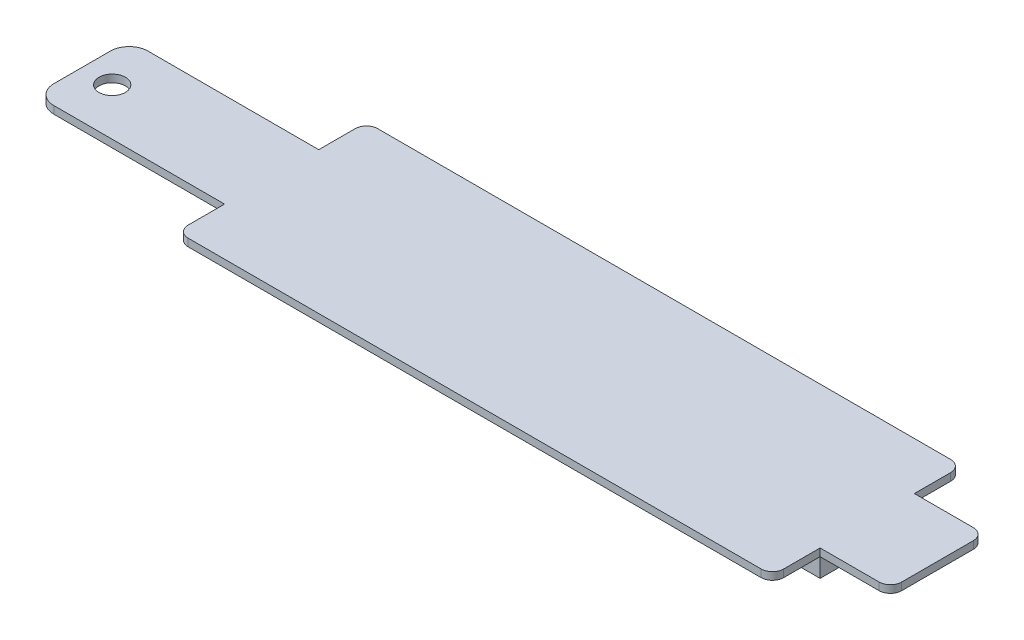
ISO-10303-21;
HEADER;
FILE_DESCRIPTION(('STEP AP214'),'2;1');
FILE_NAME('part.step','',(''),(''),'','','');
FILE_SCHEMA(('AUTOMOTIVE_DESIGN { 1 0 10303 214 1 1 1 1 }'));
ENDSEC;
DATA;
#1=APPLICATION_CONTEXT('core data for automotive mechanical design processes');
#2=APPLICATION_PROTOCOL_DEFINITION('international standard','automotive_design',2000,#1);
#3=PRODUCT_CONTEXT('',#1,'mechanical');
#4=PRODUCT('Part','Part','',(#3));
#5=PRODUCT_RELATED_PRODUCT_CATEGORY('part','',(#4));
#6=PRODUCT_DEFINITION_FORMATION('','',#4);
#7=PRODUCT_DEFINITION_CONTEXT('part definition',#1,'design');
#8=PRODUCT_DEFINITION('design','',#6,#7);
#9=PRODUCT_DEFINITION_SHAPE('','',#8);
#10=(LENGTH_UNIT() NAMED_UNIT(*) SI_UNIT(.MILLI.,.METRE.));
#11=(NAMED_UNIT(*) PLANE_ANGLE_UNIT() SI_UNIT($,.RADIAN.));
#12=(NAMED_UNIT(*) SI_UNIT($,.STERADIAN.) SOLID_ANGLE_UNIT());
#13=UNCERTAINTY_MEASURE_WITH_UNIT(LENGTH_MEASURE(1.E-05),#10,'distance_accuracy_value','');
#14=(GEOMETRIC_REPRESENTATION_CONTEXT(3) GLOBAL_UNCERTAINTY_ASSIGNED_CONTEXT((#13)) GLOBAL_UNIT_ASSIGNED_CONTEXT((#10,
#11,#12)) REPRESENTATION_CONTEXT('',''));
#15=CARTESIAN_POINT('',(0.,0.,0.));
#16=DIRECTION('',(0.,0.,1.));
#17=DIRECTION('',(1.,0.,0.));
#18=AXIS2_PLACEMENT_3D('',#15,#16,#17);
#19=CARTESIAN_POINT('',(79.,-7.,-12.5));
#20=DIRECTION('',(-1.,0.,0.));
#21=DIRECTION('',(0.,0.,1.));
#22=AXIS2_PLACEMENT_3D('',#19,#20,#21);
#23=PLANE('',#22);
#24=DIRECTION('',(0.,0.,1.));
#25=VECTOR('',#24,1.);
#26=CARTESIAN_POINT('',(79.,-2.,-12.5));
#27=LINE('',#26,#25);
#28=CARTESIAN_POINT('',(79.,-2.,-12.5));
#29=VERTEX_POINT('',#28);
#30=CARTESIAN_POINT('',(79.,-2.,12.5));
#31=VERTEX_POINT('',#30);
#32=EDGE_CURVE('E231',#29,#31,#27,.T.);
#33=ORIENTED_EDGE('',*,*,#32,.T.);
#34=DIRECTION('',(0.,1.,0.));
#35=VECTOR('',#34,1.);
#36=CARTESIAN_POINT('',(79.,-7.,12.5));
#37=LINE('',#36,#35);
#38=CARTESIAN_POINT('',(79.,-7.,12.5));
#39=VERTEX_POINT('',#38);
#40=EDGE_CURVE('E14',#39,#31,#37,.T.);
#41=ORIENTED_EDGE('',*,*,#40,.F.);
#42=DIRECTION('',(0.,0.,1.));
#43=VECTOR('',#42,1.);
#44=CARTESIAN_POINT('',(79.,-7.,-12.5));
#45=LINE('',#44,#43);
#46=CARTESIAN_POINT('',(79.,-7.,-12.5));
#47=VERTEX_POINT('',#46);
#48=EDGE_CURVE('E215',#47,#39,#45,.T.);
#49=ORIENTED_EDGE('',*,*,#48,.F.);
#50=DIRECTION('',(0.,1.,0.));
#51=VECTOR('',#50,1.);
#52=CARTESIAN_POINT('',(79.,-7.,-12.5));
#53=LINE('',#52,#51);
#54=EDGE_CURVE('E227',#47,#29,#53,.T.);
#55=ORIENTED_EDGE('',*,*,#54,.T.);
#56=EDGE_LOOP('',(#33,#41,#49,#55));
#57=FACE_BOUND('',#56,.T.);
#58=ADVANCED_FACE('F163',(#57),#23,.F.);
#59=CARTESIAN_POINT('',(-79.,-7.,12.5));
#60=DIRECTION('',(0.,0.,-1.));
#61=DIRECTION('',(-1.,0.,0.));
#62=AXIS2_PLACEMENT_3D('',#59,#60,#61);
#63=PLANE('',#62);
#64=DIRECTION('',(-1.,0.,0.));
#65=VECTOR('',#64,1.);
#66=CARTESIAN_POINT('',(-79.,-2.,12.5));
#67=LINE('',#66,#65);
#68=CARTESIAN_POINT('',(-79.,-2.,12.5));
#69=VERTEX_POINT('',#68);
#70=EDGE_CURVE('E220',#31,#69,#67,.T.);
#71=ORIENTED_EDGE('',*,*,#70,.T.);
#72=DIRECTION('',(0.,1.,0.));
#73=VECTOR('',#72,1.);
#74=CARTESIAN_POINT('',(-79.,-7.,12.5));
#75=LINE('',#74,#73);
#76=CARTESIAN_POINT('',(-79.,-7.,12.5));
#77=VERTEX_POINT('',#76);
#78=EDGE_CURVE('E172',#77,#69,#75,.T.);
#79=ORIENTED_EDGE('',*,*,#78,.F.);
#80=DIRECTION('',(-1.,0.,0.));
#81=VECTOR('',#80,1.);
#82=CARTESIAN_POINT('',(-79.,-7.,12.5));
#83=LINE('',#82,#81);
#84=EDGE_CURVE('E210',#39,#77,#83,.T.);
#85=ORIENTED_EDGE('',*,*,#84,.F.);
#86=ORIENTED_EDGE('',*,*,#40,.T.);
#87=EDGE_LOOP('',(#71,#79,#85,#86));
#88=FACE_BOUND('',#87,.T.);
#89=ADVANCED_FACE('F219',(#88),#63,.F.);
#90=CARTESIAN_POINT('',(-79.,-7.,12.5));
#91=DIRECTION('',(1.,0.,0.));
#92=DIRECTION('',(0.,0.,-1.));
#93=AXIS2_PLACEMENT_3D('',#90,#91,#92);
#94=PLANE('',#93);
#95=DIRECTION('',(0.,0.,-1.));
#96=VECTOR('',#95,1.);
#97=CARTESIAN_POINT('',(-79.,-2.,12.5));
#98=LINE('',#97,#96);
#99=CARTESIAN_POINT('',(-79.,-2.,-12.5));
#100=VERTEX_POINT('',#99);
#101=EDGE_CURVE('E197',#69,#100,#98,.T.);
#102=ORIENTED_EDGE('',*,*,#101,.T.);
#103=DIRECTION('',(0.,1.,0.));
#104=VECTOR('',#103,1.);
#105=CARTESIAN_POINT('',(-79.,-7.,-12.5));
#106=LINE('',#105,#104);
#107=CARTESIAN_POINT('',(-79.,-7.,-12.5));
#108=VERTEX_POINT('',#107);
#109=EDGE_CURVE('E222',#108,#100,#106,.T.);
#110=ORIENTED_EDGE('',*,*,#109,.F.);
#111=DIRECTION('',(0.,0.,-1.));
#112=VECTOR('',#111,1.);
#113=CARTESIAN_POINT('',(-79.,-7.,12.5));
#114=LINE('',#113,#112);
#115=EDGE_CURVE('E213',#77,#108,#114,.T.);
#116=ORIENTED_EDGE('',*,*,#115,.F.);
#117=ORIENTED_EDGE('',*,*,#78,.T.);
#118=EDGE_LOOP('',(#102,#110,#116,#117));
#119=FACE_BOUND('',#118,.T.);
#120=ADVANCED_FACE('F223',(#119),#94,.F.);
#121=CARTESIAN_POINT('',(-79.,-7.,-12.5));
#122=DIRECTION('',(0.,0.,1.));
#123=DIRECTION('',(1.,0.,0.));
#124=AXIS2_PLACEMENT_3D('',#121,#122,#123);
#125=PLANE('',#124);
#126=DIRECTION('',(1.,0.,0.));
#127=VECTOR('',#126,1.);
#128=CARTESIAN_POINT('',(-79.,-2.,-12.5));
#129=LINE('',#128,#127);
#130=EDGE_CURVE('E203',#100,#29,#129,.T.);
#131=ORIENTED_EDGE('',*,*,#130,.T.);
#132=ORIENTED_EDGE('',*,*,#54,.F.);
#133=DIRECTION('',(1.,0.,0.));
#134=VECTOR('',#133,1.);
#135=CARTESIAN_POINT('',(-79.,-7.,-12.5));
#136=LINE('',#135,#134);
#137=EDGE_CURVE('E180',#108,#47,#136,.T.);
#138=ORIENTED_EDGE('',*,*,#137,.F.);
#139=ORIENTED_EDGE('',*,*,#109,.T.);
#140=EDGE_LOOP('',(#131,#132,#138,#139));
#141=FACE_BOUND('',#140,.T.);
#142=ADVANCED_FACE('F244',(#141),#125,.F.);
#143=CARTESIAN_POINT('',(0.,-7.,0.));
#144=DIRECTION('',(0.,1.,0.));
#145=DIRECTION('',(0.,0.,1.));
#146=AXIS2_PLACEMENT_3D('',#143,#144,#145);
#147=PLANE('',#146);
#148=ORIENTED_EDGE('',*,*,#48,.T.);
#149=ORIENTED_EDGE('',*,*,#84,.T.);
#150=ORIENTED_EDGE('',*,*,#115,.T.);
#151=ORIENTED_EDGE('',*,*,#137,.T.);
#152=EDGE_LOOP('',(#148,#149,#150,#151));
#153=FACE_BOUND('',#152,.T.);
#154=ADVANCED_FACE('F211',(#153),#147,.F.);
#155=CARTESIAN_POINT('',(0.,-2.,0.));
#156=DIRECTION('',(0.,1.,0.));
#157=DIRECTION('',(0.,0.,1.));
#158=AXIS2_PLACEMENT_3D('',#155,#156,#157);
#159=PLANE('',#158);
#160=ORIENTED_EDGE('',*,*,#32,.F.);
#161=ORIENTED_EDGE('',*,*,#130,.F.);
#162=ORIENTED_EDGE('',*,*,#101,.F.);
#163=ORIENTED_EDGE('',*,*,#70,.F.);
#164=EDGE_LOOP('',(#160,#161,#162,#163));
#165=FACE_BOUND('',#164,.T.);
#166=ADVANCED_FACE('F247',(#165),#159,.T.);
#167=CLOSED_SHELL('',(#58,#89,#120,#142,#154,#166));
#168=MANIFOLD_SOLID_BREP('B2_NOT_SHOWN',#167);
#169=CARTESIAN_POINT('',(-108.649557127313,1.11022302462516E-13,-12.5));
#170=DIRECTION('',(0.,0.,1.));
#171=DIRECTION('',(-1.,0.,0.));
#172=AXIS2_PLACEMENT_3D('',#169,#170,#171);
#173=PLANE('',#172);
#174=DIRECTION('',(-1.,0.,0.));
#175=VECTOR('',#174,1.);
#176=CARTESIAN_POINT('',(-84.6495571273126,0.,-12.5));
#177=LINE('',#176,#175);
#178=CARTESIAN_POINT('',(-79.,0.,-12.5));
#179=VERTEX_POINT('',#178);
#180=CARTESIAN_POINT('',(-124.299114254626,1.80411241501588E-13,-12.5));
#181=VERTEX_POINT('',#180);
#182=EDGE_CURVE('E583',#179,#181,#177,.T.);
#183=ORIENTED_EDGE('',*,*,#182,.F.);
#184=DIRECTION('',(0.,1.,0.));
#185=VECTOR('',#184,1.);
#186=CARTESIAN_POINT('',(-79.,-2.,-12.5));
#187=LINE('',#186,#185);
#188=CARTESIAN_POINT('',(-79.,-2.,-12.5));
#189=VERTEX_POINT('',#188);
#190=EDGE_CURVE('E307',#189,#179,#187,.T.);
#191=ORIENTED_EDGE('',*,*,#190,.F.);
#192=DIRECTION('',(1.,0.,0.));
#193=VECTOR('',#192,1.);
#194=CARTESIAN_POINT('',(-108.649557127313,-1.99999999999989,-12.5));
#195=LINE('',#194,#193);
#196=CARTESIAN_POINT('',(-124.299114254626,-1.99999999999982,-12.5));
#197=VERTEX_POINT('',#196);
#198=EDGE_CURVE('E552',#189,#197,#195,.F.);
#199=ORIENTED_EDGE('',*,*,#198,.T.);
#200=DIRECTION('',(0.,1.,0.));
#201=VECTOR('',#200,1.);
#202=CARTESIAN_POINT('',(-124.299114254626,-1.99999999999982,-12.5));
#203=LINE('',#202,#201);
#204=EDGE_CURVE('E549',#197,#181,#203,.T.);
#205=ORIENTED_EDGE('',*,*,#204,.T.);
#206=EDGE_LOOP('',(#183,#191,#199,#205));
#207=FACE_BOUND('',#206,.T.);
#208=ADVANCED_FACE('F299',(#207),#173,.F.);
#209=CARTESIAN_POINT('',(-86.6495571273129,0.,12.5));
#210=DIRECTION('',(0.,0.,-1.));
#211=DIRECTION('',(1.,0.,0.));
#212=AXIS2_PLACEMENT_3D('',#209,#210,#211);
#213=PLANE('',#212);
#214=DIRECTION('',(-1.,0.,0.));
#215=VECTOR('',#214,1.);
#216=CARTESIAN_POINT('',(-86.6495571273129,-2.00000000000002,12.5));
#217=LINE('',#216,#215);
#218=CARTESIAN_POINT('',(-124.299114254626,-1.99999999999979,12.5));
#219=VERTEX_POINT('',#218);
#220=CARTESIAN_POINT('',(-79.,-2.,12.5));
#221=VERTEX_POINT('',#220);
#222=EDGE_CURVE('E585',#219,#221,#217,.F.);
#223=ORIENTED_EDGE('',*,*,#222,.T.);
#224=DIRECTION('',(0.,1.,0.));
#225=VECTOR('',#224,1.);
#226=CARTESIAN_POINT('',(-79.,-2.,12.5));
#227=LINE('',#226,#225);
#228=CARTESIAN_POINT('',(-79.,0.,12.5));
#229=VERTEX_POINT('',#228);
#230=EDGE_CURVE('E589',#221,#229,#227,.T.);
#231=ORIENTED_EDGE('',*,*,#230,.T.);
#232=DIRECTION('',(1.,0.,0.));
#233=VECTOR('',#232,1.);
#234=CARTESIAN_POINT('',(-84.6495571273126,0.,12.5));
#235=LINE('',#234,#233);
#236=CARTESIAN_POINT('',(-124.299114254626,2.08166817117217E-13,12.5));
#237=VERTEX_POINT('',#236);
#238=EDGE_CURVE('E322',#237,#229,#235,.T.);
#239=ORIENTED_EDGE('',*,*,#238,.F.);
#240=DIRECTION('',(0.,1.,0.));
#241=VECTOR('',#240,1.);
#242=CARTESIAN_POINT('',(-124.299114254626,-1.99999999999979,12.5));
#243=LINE('',#242,#241);
#244=EDGE_CURVE('E557',#237,#219,#243,.F.);
#245=ORIENTED_EDGE('',*,*,#244,.T.);
#246=EDGE_LOOP('',(#223,#231,#239,#245));
#247=FACE_BOUND('',#246,.T.);
#248=ADVANCED_FACE('F626',(#247),#213,.F.);
#249=CARTESIAN_POINT('',(0.,0.,0.));
#250=DIRECTION('',(0.,-1.,0.));
#251=DIRECTION('',(0.,0.,-1.));
#252=AXIS2_PLACEMENT_3D('',#249,#250,#251);
#253=PLANE('',#252);
#254=ORIENTED_EDGE('',*,*,#238,.T.);
#255=DIRECTION('',(0.,0.,-1.));
#256=VECTOR('',#255,1.);
#257=CARTESIAN_POINT('',(-79.,0.,14.8247785636564));
#258=LINE('',#257,#256);
#259=CARTESIAN_POINT('',(-79.,0.,22.1495571273129));
#260=VERTEX_POINT('',#259);
#261=EDGE_CURVE('E505',#260,#229,#258,.T.);
#262=ORIENTED_EDGE('',*,*,#261,.F.);
#263=CARTESIAN_POINT('',(-76.,0.,22.1495571273129));
#264=DIRECTION('',(0.,1.,0.));
#265=DIRECTION('',(-1.,0.,0.));
#266=AXIS2_PLACEMENT_3D('',#263,#264,#265);
#267=CIRCLE('',#266,3.);
#268=CARTESIAN_POINT('',(-76.,0.,25.1495571273129));
#269=VERTEX_POINT('',#268);
#270=EDGE_CURVE('E482',#260,#269,#267,.T.);
#271=ORIENTED_EDGE('',*,*,#270,.T.);
#272=DIRECTION('',(1.,0.,0.));
#273=VECTOR('',#272,1.);
#274=CARTESIAN_POINT('',(-79.,0.,25.1495571273129));
#275=LINE('',#274,#273);
#276=CARTESIAN_POINT('',(76.,0.,25.1495571273129));
#277=VERTEX_POINT('',#276);
#278=EDGE_CURVE('E471',#277,#269,#275,.F.);
#279=ORIENTED_EDGE('',*,*,#278,.F.);
#280=CARTESIAN_POINT('',(76.,0.,22.1495571273129));
#281=DIRECTION('',(0.,1.,0.));
#282=DIRECTION('',(-1.,0.,0.));
#283=AXIS2_PLACEMENT_3D('',#280,#281,#282);
#284=CIRCLE('',#283,3.);
#285=CARTESIAN_POINT('',(79.,0.,22.1495571273129));
#286=VERTEX_POINT('',#285);
#287=EDGE_CURVE('E479',#277,#286,#284,.T.);
#288=ORIENTED_EDGE('',*,*,#287,.T.);
#289=DIRECTION('',(0.,0.,-1.));
#290=VECTOR('',#289,1.);
#291=CARTESIAN_POINT('',(79.,0.,14.8247785636564));
#292=LINE('',#291,#290);
#293=CARTESIAN_POINT('',(79.,0.,12.5));
#294=VERTEX_POINT('',#293);
#295=EDGE_CURVE('E478',#294,#286,#292,.F.);
#296=ORIENTED_EDGE('',*,*,#295,.F.);
#297=DIRECTION('',(-1.,0.,0.));
#298=VECTOR('',#297,1.);
#299=CARTESIAN_POINT('',(87.,0.,12.5));
#300=LINE('',#299,#298);
#301=CARTESIAN_POINT('',(94.6495571273129,0.,12.5));
#302=VERTEX_POINT('',#301);
#303=EDGE_CURVE('E514',#302,#294,#300,.T.);
#304=ORIENTED_EDGE('',*,*,#303,.F.);
#305=CARTESIAN_POINT('',(94.6495571273129,0.,9.49999999999998));
#306=DIRECTION('',(0.,1.,0.));
#307=DIRECTION('',(-1.,0.,0.));
#308=AXIS2_PLACEMENT_3D('',#305,#306,#307);
#309=CIRCLE('',#308,3.);
#310=CARTESIAN_POINT('',(97.6495571273129,0.,9.49999999999998));
#311=VERTEX_POINT('',#310);
#312=EDGE_CURVE('E515',#302,#311,#309,.T.);
#313=ORIENTED_EDGE('',*,*,#312,.T.);
#314=DIRECTION('',(0.,0.,-1.));
#315=VECTOR('',#314,1.);
#316=CARTESIAN_POINT('',(97.6495571273129,0.,12.5));
#317=LINE('',#316,#315);
#318=CARTESIAN_POINT('',(97.6495571273129,0.,-9.49999999999998));
#319=VERTEX_POINT('',#318);
#320=EDGE_CURVE('E533',#319,#311,#317,.F.);
#321=ORIENTED_EDGE('',*,*,#320,.F.);
#322=CARTESIAN_POINT('',(94.6495571273129,0.,-9.49999999999998));
#323=DIRECTION('',(0.,1.,0.));
#324=DIRECTION('',(-1.,0.,0.));
#325=AXIS2_PLACEMENT_3D('',#322,#323,#324);
#326=CIRCLE('',#325,3.);
#327=CARTESIAN_POINT('',(94.6495571273129,0.,-12.5));
#328=VERTEX_POINT('',#327);
#329=EDGE_CURVE('E517',#319,#328,#326,.T.);
#330=ORIENTED_EDGE('',*,*,#329,.T.);
#331=DIRECTION('',(-1.,0.,0.));
#332=VECTOR('',#331,1.);
#333=CARTESIAN_POINT('',(87.,0.,-12.5));
#334=LINE('',#333,#332);
#335=CARTESIAN_POINT('',(79.,0.,-12.5));
#336=VERTEX_POINT('',#335);
#337=EDGE_CURVE('E538',#328,#336,#334,.T.);
#338=ORIENTED_EDGE('',*,*,#337,.T.);
#339=DIRECTION('',(0.,0.,-1.));
#340=VECTOR('',#339,1.);
#341=CARTESIAN_POINT('',(79.,0.,-14.8247785636564));
#342=LINE('',#341,#340);
#343=CARTESIAN_POINT('',(79.,0.,-22.1495571273129));
#344=VERTEX_POINT('',#343);
#345=EDGE_CURVE('E314',#344,#336,#342,.F.);
#346=ORIENTED_EDGE('',*,*,#345,.F.);
#347=CARTESIAN_POINT('',(76.,0.,-22.1495571273129));
#348=DIRECTION('',(0.,1.,0.));
#349=DIRECTION('',(0.,0.,1.));
#350=AXIS2_PLACEMENT_3D('',#347,#348,#349);
#351=CIRCLE('',#350,3.);
#352=CARTESIAN_POINT('',(76.,0.,-25.1495571273129));
#353=VERTEX_POINT('',#352);
#354=EDGE_CURVE('E435',#344,#353,#351,.T.);
#355=ORIENTED_EDGE('',*,*,#354,.T.);
#356=DIRECTION('',(-1.,0.,0.));
#357=VECTOR('',#356,1.);
#358=CARTESIAN_POINT('',(79.,0.,-25.1495571273129));
#359=LINE('',#358,#357);
#360=CARTESIAN_POINT('',(-76.,0.,-25.1495571273129));
#361=VERTEX_POINT('',#360);
#362=EDGE_CURVE('E439',#361,#353,#359,.F.);
#363=ORIENTED_EDGE('',*,*,#362,.F.);
#364=CARTESIAN_POINT('',(-76.,0.,-22.1495571273129));
#365=DIRECTION('',(0.,1.,0.));
#366=DIRECTION('',(0.,0.,1.));
#367=AXIS2_PLACEMENT_3D('',#364,#365,#366);
#368=CIRCLE('',#367,3.);
#369=CARTESIAN_POINT('',(-79.,0.,-22.1495571273129));
#370=VERTEX_POINT('',#369);
#371=EDGE_CURVE('E444',#361,#370,#368,.T.);
#372=ORIENTED_EDGE('',*,*,#371,.T.);
#373=DIRECTION('',(0.,0.,-1.));
#374=VECTOR('',#373,1.);
#375=CARTESIAN_POINT('',(-79.,0.,-14.8247785636564));
#376=LINE('',#375,#374);
#377=EDGE_CURVE('E472',#179,#370,#376,.T.);
#378=ORIENTED_EDGE('',*,*,#377,.F.);
#379=ORIENTED_EDGE('',*,*,#182,.T.);
#380=CARTESIAN_POINT('',(-124.299114254626,1.80411241501588E-13,-7.49999999999995));
#381=DIRECTION('',(0.,1.,0.));
#382=DIRECTION('',(0.,0.,1.));
#383=AXIS2_PLACEMENT_3D('',#380,#381,#382);
#384=CIRCLE('',#383,5.);
#385=CARTESIAN_POINT('',(-129.299114254626,1.80411241501588E-13,-7.49999999999995));
#386=VERTEX_POINT('',#385);
#387=EDGE_CURVE('E553',#181,#386,#384,.T.);
#388=ORIENTED_EDGE('',*,*,#387,.T.);
#389=DIRECTION('',(0.,0.,1.));
#390=VECTOR('',#389,1.);
#391=CARTESIAN_POINT('',(-129.299114254626,1.80411241501588E-13,-12.5));
#392=LINE('',#391,#390);
#393=CARTESIAN_POINT('',(-129.299114254626,2.08166817117217E-13,7.5));
#394=VERTEX_POINT('',#393);
#395=EDGE_CURVE('E576',#394,#386,#392,.F.);
#396=ORIENTED_EDGE('',*,*,#395,.F.);
#397=CARTESIAN_POINT('',(-124.299114254626,2.08166817117217E-13,7.5));
#398=DIRECTION('',(0.,1.,0.));
#399=DIRECTION('',(0.,0.,1.));
#400=AXIS2_PLACEMENT_3D('',#397,#398,#399);
#401=CIRCLE('',#400,5.);
#402=EDGE_CURVE('E555',#394,#237,#401,.T.);
#403=ORIENTED_EDGE('',*,*,#402,.T.);
#404=EDGE_LOOP('',(#254,#262,#271,#279,#288,#296,#304,#313,#321,#330,#338,#346,#355,#363,#372,
#378,#379,#388,#396,#403));
#405=FACE_BOUND('',#404,.T.);
#406=CARTESIAN_POINT('',(-121.299114254626,1.2490009027033E-13,0.));
#407=DIRECTION('',(0.,1.,0.));
#408=DIRECTION('',(0.,0.,1.));
#409=AXIS2_PLACEMENT_3D('',#406,#407,#408);
#410=CIRCLE('',#409,3.50000000000001);
#411=CARTESIAN_POINT('',(-121.299114254626,1.28694797874029E-13,3.50000000000001));
#412=VERTEX_POINT('',#411);
#413=EDGE_CURVE('E571',#412,#412,#410,.T.);
#414=ORIENTED_EDGE('',*,*,#413,.F.);
#415=EDGE_LOOP('',(#414));
#416=FACE_BOUND('',#415,.T.);
#417=ADVANCED_FACE('F301',(#405,#416),#253,.F.);
#418=CARTESIAN_POINT('',(-84.6495571273126,-2.00000000000006,0.));
#419=DIRECTION('',(0.,-1.,0.));
#420=DIRECTION('',(1.,0.,0.));
#421=AXIS2_PLACEMENT_3D('',#418,#419,#420);
#422=PLANE('',#421);
#423=ORIENTED_EDGE('',*,*,#198,.F.);
#424=DIRECTION('',(0.,0.,-1.));
#425=VECTOR('',#424,1.);
#426=CARTESIAN_POINT('',(-79.,-2.,-14.8247785636564));
#427=LINE('',#426,#425);
#428=CARTESIAN_POINT('',(-79.,-2.00000000000006,-22.1495571273128));
#429=VERTEX_POINT('',#428);
#430=EDGE_CURVE('E466',#189,#429,#427,.T.);
#431=ORIENTED_EDGE('',*,*,#430,.T.);
#432=CARTESIAN_POINT('',(-76.,-2.00000000000006,-22.1495571273128));
#433=DIRECTION('',(0.,1.,0.));
#434=DIRECTION('',(0.,0.,1.));
#435=AXIS2_PLACEMENT_3D('',#432,#433,#434);
#436=CIRCLE('',#435,3.);
#437=CARTESIAN_POINT('',(-76.,-2.00000000000009,-25.1495571273128));
#438=VERTEX_POINT('',#437);
#439=EDGE_CURVE('E459',#429,#438,#436,.F.);
#440=ORIENTED_EDGE('',*,*,#439,.T.);
#441=DIRECTION('',(1.,0.,0.));
#442=VECTOR('',#441,1.);
#443=CARTESIAN_POINT('',(0.,-2.00000000000009,-25.1495571273129));
#444=LINE('',#443,#442);
#445=CARTESIAN_POINT('',(76.,-2.00000000000009,-25.1495571273129));
#446=VERTEX_POINT('',#445);
#447=EDGE_CURVE('E461',#438,#446,#444,.T.);
#448=ORIENTED_EDGE('',*,*,#447,.T.);
#449=CARTESIAN_POINT('',(76.,-2.00000000000006,-22.1495571273129));
#450=DIRECTION('',(0.,1.,0.));
#451=DIRECTION('',(0.,0.,1.));
#452=AXIS2_PLACEMENT_3D('',#449,#450,#451);
#453=CIRCLE('',#452,3.);
#454=CARTESIAN_POINT('',(79.,-2.00000000000006,-22.1495571273129));
#455=VERTEX_POINT('',#454);
#456=EDGE_CURVE('E458',#446,#455,#453,.F.);
#457=ORIENTED_EDGE('',*,*,#456,.T.);
#458=DIRECTION('',(0.,0.,-1.));
#459=VECTOR('',#458,1.);
#460=CARTESIAN_POINT('',(79.,-2.,-14.8247785636564));
#461=LINE('',#460,#459);
#462=CARTESIAN_POINT('',(79.,-2.,-12.5));
#463=VERTEX_POINT('',#462);
#464=EDGE_CURVE('E468',#455,#463,#461,.F.);
#465=ORIENTED_EDGE('',*,*,#464,.T.);
#466=DIRECTION('',(-1.,0.,0.));
#467=VECTOR('',#466,1.);
#468=CARTESIAN_POINT('',(87.,-2.00000000000001,-12.5));
#469=LINE('',#468,#467);
#470=CARTESIAN_POINT('',(94.6495571273129,-2.,-12.5));
#471=VERTEX_POINT('',#470);
#472=EDGE_CURVE('E544',#471,#463,#469,.T.);
#473=ORIENTED_EDGE('',*,*,#472,.F.);
#474=CARTESIAN_POINT('',(94.6495571273129,-2.,-9.49999999999998));
#475=DIRECTION('',(0.,1.,0.));
#476=DIRECTION('',(-1.,0.,0.));
#477=AXIS2_PLACEMENT_3D('',#474,#475,#476);
#478=CIRCLE('',#477,3.);
#479=CARTESIAN_POINT('',(97.6495571273129,-2.00000000000003,-9.49999999999998));
#480=VERTEX_POINT('',#479);
#481=EDGE_CURVE('E529',#471,#480,#478,.F.);
#482=ORIENTED_EDGE('',*,*,#481,.T.);
#483=DIRECTION('',(0.,0.,1.));
#484=VECTOR('',#483,1.);
#485=CARTESIAN_POINT('',(97.6495571273129,-2.00000000000003,0.));
#486=LINE('',#485,#484);
#487=CARTESIAN_POINT('',(97.6495571273129,-2.00000000000003,9.49999999999998));
#488=VERTEX_POINT('',#487);
#489=EDGE_CURVE('E526',#480,#488,#486,.T.);
#490=ORIENTED_EDGE('',*,*,#489,.T.);
#491=CARTESIAN_POINT('',(94.6495571273129,-2.,9.49999999999998));
#492=DIRECTION('',(0.,1.,0.));
#493=DIRECTION('',(-1.,0.,0.));
#494=AXIS2_PLACEMENT_3D('',#491,#492,#493);
#495=CIRCLE('',#494,3.);
#496=CARTESIAN_POINT('',(94.6495571273129,-2.,12.5));
#497=VERTEX_POINT('',#496);
#498=EDGE_CURVE('E523',#488,#497,#495,.F.);
#499=ORIENTED_EDGE('',*,*,#498,.T.);
#500=DIRECTION('',(-1.,0.,0.));
#501=VECTOR('',#500,1.);
#502=CARTESIAN_POINT('',(87.,-2.00000000000001,12.5));
#503=LINE('',#502,#501);
#504=CARTESIAN_POINT('',(79.,-2.,12.5));
#505=VERTEX_POINT('',#504);
#506=EDGE_CURVE('E541',#497,#505,#503,.T.);
#507=ORIENTED_EDGE('',*,*,#506,.T.);
#508=DIRECTION('',(0.,0.,-1.));
#509=VECTOR('',#508,1.);
#510=CARTESIAN_POINT('',(79.,-2.,14.8247785636564));
#511=LINE('',#510,#509);
#512=CARTESIAN_POINT('',(79.,-2.00000000000002,22.1495571273129));
#513=VERTEX_POINT('',#512);
#514=EDGE_CURVE('E502',#505,#513,#511,.F.);
#515=ORIENTED_EDGE('',*,*,#514,.T.);
#516=CARTESIAN_POINT('',(76.,-2.00000000000002,22.1495571273129));
#517=DIRECTION('',(0.,1.,0.));
#518=DIRECTION('',(-1.,0.,0.));
#519=AXIS2_PLACEMENT_3D('',#516,#517,#518);
#520=CIRCLE('',#519,3.);
#521=CARTESIAN_POINT('',(76.,-2.00000000000003,25.1495571273129));
#522=VERTEX_POINT('',#521);
#523=EDGE_CURVE('E487',#513,#522,#520,.F.);
#524=ORIENTED_EDGE('',*,*,#523,.T.);
#525=DIRECTION('',(-1.,0.,0.));
#526=VECTOR('',#525,1.);
#527=CARTESIAN_POINT('',(0.,-2.00000000000002,25.1495571273129));
#528=LINE('',#527,#526);
#529=CARTESIAN_POINT('',(-76.,-2.00000000000001,25.1495571273129));
#530=VERTEX_POINT('',#529);
#531=EDGE_CURVE('E492',#522,#530,#528,.T.);
#532=ORIENTED_EDGE('',*,*,#531,.T.);
#533=CARTESIAN_POINT('',(-76.,-2.,22.1495571273129));
#534=DIRECTION('',(0.,1.,0.));
#535=DIRECTION('',(-1.,0.,0.));
#536=AXIS2_PLACEMENT_3D('',#533,#534,#535);
#537=CIRCLE('',#536,3.);
#538=CARTESIAN_POINT('',(-79.,-2.,22.1495571273129));
#539=VERTEX_POINT('',#538);
#540=EDGE_CURVE('E489',#530,#539,#537,.F.);
#541=ORIENTED_EDGE('',*,*,#540,.T.);
#542=DIRECTION('',(0.,0.,-1.));
#543=VECTOR('',#542,1.);
#544=CARTESIAN_POINT('',(-79.,-2.,14.8247785636564));
#545=LINE('',#544,#543);
#546=EDGE_CURVE('E504',#539,#221,#545,.T.);
#547=ORIENTED_EDGE('',*,*,#546,.T.);
#548=ORIENTED_EDGE('',*,*,#222,.F.);
#549=CARTESIAN_POINT('',(-124.299114254626,-1.99999999999979,7.5));
#550=DIRECTION('',(0.,1.,0.));
#551=DIRECTION('',(0.,0.,1.));
#552=AXIS2_PLACEMENT_3D('',#549,#550,#551);
#553=CIRCLE('',#552,5.);
#554=CARTESIAN_POINT('',(-129.299114254626,-1.99999999999979,7.5));
#555=VERTEX_POINT('',#554);
#556=EDGE_CURVE('E566',#219,#555,#553,.F.);
#557=ORIENTED_EDGE('',*,*,#556,.T.);
#558=DIRECTION('',(0.,0.,-1.));
#559=VECTOR('',#558,1.);
#560=CARTESIAN_POINT('',(-129.299114254626,-1.99999999999981,0.));
#561=LINE('',#560,#559);
#562=CARTESIAN_POINT('',(-129.299114254626,-1.99999999999982,-7.49999999999995));
#563=VERTEX_POINT('',#562);
#564=EDGE_CURVE('E563',#555,#563,#561,.T.);
#565=ORIENTED_EDGE('',*,*,#564,.T.);
#566=CARTESIAN_POINT('',(-124.299114254626,-1.99999999999982,-7.49999999999995));
#567=DIRECTION('',(0.,1.,0.));
#568=DIRECTION('',(0.,0.,1.));
#569=AXIS2_PLACEMENT_3D('',#566,#567,#568);
#570=CIRCLE('',#569,5.);
#571=EDGE_CURVE('E560',#563,#197,#570,.F.);
#572=ORIENTED_EDGE('',*,*,#571,.T.);
#573=EDGE_LOOP('',(#423,#431,#440,#448,#457,#465,#473,#482,#490,#499,#507,#515,#524,#532,#541,
#547,#548,#557,#565,#572));
#574=FACE_BOUND('',#573,.T.);
#575=CARTESIAN_POINT('',(-121.299114254626,-1.99999999999982,0.));
#576=DIRECTION('',(0.,1.,0.));
#577=DIRECTION('',(0.,0.,1.));
#578=AXIS2_PLACEMENT_3D('',#575,#576,#577);
#579=CIRCLE('',#578,3.50000000000001);
#580=CARTESIAN_POINT('',(-121.299114254626,-1.99999999999982,3.50000000000001));
#581=VERTEX_POINT('',#580);
#582=EDGE_CURVE('E568',#581,#581,#579,.T.);
#583=ORIENTED_EDGE('',*,*,#582,.T.);
#584=EDGE_LOOP('',(#583));
#585=FACE_BOUND('',#584,.T.);
#586=ADVANCED_FACE('F609',(#574,#585),#422,.T.);
#587=CARTESIAN_POINT('',(-124.299114254626,-1.99999999999982,-7.49999999999995));
#588=DIRECTION('',(0.,1.,0.));
#589=DIRECTION('',(0.,0.,1.));
#590=AXIS2_PLACEMENT_3D('',#587,#588,#589);
#591=CYLINDRICAL_SURFACE('',#590,5.);
#592=ORIENTED_EDGE('',*,*,#571,.F.);
#593=DIRECTION('',(0.,1.,0.));
#594=VECTOR('',#593,1.);
#595=CARTESIAN_POINT('',(-129.299114254626,-1.99999999999982,-7.49999999999995));
#596=LINE('',#595,#594);
#597=EDGE_CURVE('E574',#386,#563,#596,.F.);
#598=ORIENTED_EDGE('',*,*,#597,.F.);
#599=ORIENTED_EDGE('',*,*,#387,.F.);
#600=ORIENTED_EDGE('',*,*,#204,.F.);
#601=EDGE_LOOP('',(#592,#598,#599,#600));
#602=FACE_BOUND('',#601,.T.);
#603=ADVANCED_FACE('F614',(#602),#591,.T.);
#604=CARTESIAN_POINT('',(-129.299114254626,-1.99999999999982,-12.5));
#605=DIRECTION('',(1.,0.,0.));
#606=DIRECTION('',(0.,1.,0.));
#607=AXIS2_PLACEMENT_3D('',#604,#605,#606);
#608=PLANE('',#607);
#609=ORIENTED_EDGE('',*,*,#564,.F.);
#610=DIRECTION('',(0.,1.,0.));
#611=VECTOR('',#610,1.);
#612=CARTESIAN_POINT('',(-129.299114254626,-1.99999999999979,7.5));
#613=LINE('',#612,#611);
#614=EDGE_CURVE('E540',#555,#394,#613,.T.);
#615=ORIENTED_EDGE('',*,*,#614,.T.);
#616=ORIENTED_EDGE('',*,*,#395,.T.);
#617=ORIENTED_EDGE('',*,*,#597,.T.);
#618=EDGE_LOOP('',(#609,#615,#616,#617));
#619=FACE_BOUND('',#618,.T.);
#620=ADVANCED_FACE('F619',(#619),#608,.F.);
#621=CARTESIAN_POINT('',(-124.299114254626,-1.99999999999979,7.5));
#622=DIRECTION('',(0.,1.,0.));
#623=DIRECTION('',(0.,0.,1.));
#624=AXIS2_PLACEMENT_3D('',#621,#622,#623);
#625=CYLINDRICAL_SURFACE('',#624,5.);
#626=ORIENTED_EDGE('',*,*,#556,.F.);
#627=ORIENTED_EDGE('',*,*,#244,.F.);
#628=ORIENTED_EDGE('',*,*,#402,.F.);
#629=ORIENTED_EDGE('',*,*,#614,.F.);
#630=EDGE_LOOP('',(#626,#627,#628,#629));
#631=FACE_BOUND('',#630,.T.);
#632=ADVANCED_FACE('F623',(#631),#625,.T.);
#633=CARTESIAN_POINT('',(-121.299114254626,-9.99999999999986,0.));
#634=DIRECTION('',(0.,1.,0.));
#635=DIRECTION('',(0.,0.,1.));
#636=AXIS2_PLACEMENT_3D('',#633,#634,#635);
#637=CYLINDRICAL_SURFACE('',#636,3.50000000000001);
#638=ORIENTED_EDGE('',*,*,#413,.T.);
#639=EDGE_LOOP('',(#638));
#640=FACE_BOUND('',#639,.T.);
#641=ORIENTED_EDGE('',*,*,#582,.F.);
#642=EDGE_LOOP('',(#641));
#643=FACE_BOUND('',#642,.T.);
#644=ADVANCED_FACE('F686',(#640,#643),#637,.F.);
#645=CARTESIAN_POINT('',(87.,0.,12.5));
#646=DIRECTION('',(0.,0.,-1.));
#647=DIRECTION('',(0.,-1.,0.));
#648=AXIS2_PLACEMENT_3D('',#645,#646,#647);
#649=PLANE('',#648);
#650=ORIENTED_EDGE('',*,*,#506,.F.);
#651=DIRECTION('',(0.,1.,0.));
#652=VECTOR('',#651,1.);
#653=CARTESIAN_POINT('',(94.6495571273129,-2.,12.5));
#654=LINE('',#653,#652);
#655=EDGE_CURVE('E511',#497,#302,#654,.T.);
#656=ORIENTED_EDGE('',*,*,#655,.T.);
#657=ORIENTED_EDGE('',*,*,#303,.T.);
#658=DIRECTION('',(0.,1.,0.));
#659=VECTOR('',#658,1.);
#660=CARTESIAN_POINT('',(79.,-2.,12.5));
#661=LINE('',#660,#659);
#662=EDGE_CURVE('E582',#505,#294,#661,.T.);
#663=ORIENTED_EDGE('',*,*,#662,.F.);
#664=EDGE_LOOP('',(#650,#656,#657,#663));
#665=FACE_BOUND('',#664,.T.);
#666=ADVANCED_FACE('F650',(#665),#649,.F.);
#667=CARTESIAN_POINT('',(87.,0.,-12.5));
#668=DIRECTION('',(0.,0.,-1.));
#669=DIRECTION('',(0.,-1.,0.));
#670=AXIS2_PLACEMENT_3D('',#667,#668,#669);
#671=PLANE('',#670);
#672=ORIENTED_EDGE('',*,*,#337,.F.);
#673=DIRECTION('',(0.,1.,0.));
#674=VECTOR('',#673,1.);
#675=CARTESIAN_POINT('',(94.6495571273129,-2.,-12.5));
#676=LINE('',#675,#674);
#677=EDGE_CURVE('E520',#328,#471,#676,.F.);
#678=ORIENTED_EDGE('',*,*,#677,.T.);
#679=ORIENTED_EDGE('',*,*,#472,.T.);
#680=DIRECTION('',(0.,1.,0.));
#681=VECTOR('',#680,1.);
#682=CARTESIAN_POINT('',(79.,-2.,-12.5));
#683=LINE('',#682,#681);
#684=EDGE_CURVE('E161',#463,#336,#683,.T.);
#685=ORIENTED_EDGE('',*,*,#684,.T.);
#686=EDGE_LOOP('',(#672,#678,#679,#685));
#687=FACE_BOUND('',#686,.T.);
#688=ADVANCED_FACE('F666',(#687),#671,.T.);
#689=CARTESIAN_POINT('',(94.6495571273129,-2.,9.49999999999998));
#690=DIRECTION('',(0.,1.,0.));
#691=DIRECTION('',(-1.,0.,0.));
#692=AXIS2_PLACEMENT_3D('',#689,#690,#691);
#693=CYLINDRICAL_SURFACE('',#692,3.);
#694=ORIENTED_EDGE('',*,*,#498,.F.);
#695=DIRECTION('',(0.,1.,0.));
#696=VECTOR('',#695,1.);
#697=CARTESIAN_POINT('',(97.6495571273129,-2.00000000000003,9.49999999999998));
#698=LINE('',#697,#696);
#699=EDGE_CURVE('E531',#311,#488,#698,.F.);
#700=ORIENTED_EDGE('',*,*,#699,.F.);
#701=ORIENTED_EDGE('',*,*,#312,.F.);
#702=ORIENTED_EDGE('',*,*,#655,.F.);
#703=EDGE_LOOP('',(#694,#700,#701,#702));
#704=FACE_BOUND('',#703,.T.);
#705=ADVANCED_FACE('F654',(#704),#693,.T.);
#706=CARTESIAN_POINT('',(97.6495571273129,-2.00000000000003,12.5));
#707=DIRECTION('',(-1.,0.,0.));
#708=DIRECTION('',(0.,-1.,0.));
#709=AXIS2_PLACEMENT_3D('',#706,#707,#708);
#710=PLANE('',#709);
#711=ORIENTED_EDGE('',*,*,#489,.F.);
#712=DIRECTION('',(0.,1.,0.));
#713=VECTOR('',#712,1.);
#714=CARTESIAN_POINT('',(97.6495571273129,-2.00000000000003,-9.49999999999998));
#715=LINE('',#714,#713);
#716=EDGE_CURVE('E508',#480,#319,#715,.T.);
#717=ORIENTED_EDGE('',*,*,#716,.T.);
#718=ORIENTED_EDGE('',*,*,#320,.T.);
#719=ORIENTED_EDGE('',*,*,#699,.T.);
#720=EDGE_LOOP('',(#711,#717,#718,#719));
#721=FACE_BOUND('',#720,.T.);
#722=ADVANCED_FACE('F659',(#721),#710,.F.);
#723=CARTESIAN_POINT('',(94.6495571273129,-2.,-9.49999999999998));
#724=DIRECTION('',(0.,1.,0.));
#725=DIRECTION('',(-1.,0.,0.));
#726=AXIS2_PLACEMENT_3D('',#723,#724,#725);
#727=CYLINDRICAL_SURFACE('',#726,3.);
#728=ORIENTED_EDGE('',*,*,#481,.F.);
#729=ORIENTED_EDGE('',*,*,#677,.F.);
#730=ORIENTED_EDGE('',*,*,#329,.F.);
#731=ORIENTED_EDGE('',*,*,#716,.F.);
#732=EDGE_LOOP('',(#728,#729,#730,#731));
#733=FACE_BOUND('',#732,.T.);
#734=ADVANCED_FACE('F663',(#733),#727,.T.);
#735=CARTESIAN_POINT('',(79.,-1.04,14.8247785636564));
#736=DIRECTION('',(-1.,0.,0.));
#737=DIRECTION('',(0.,0.,-1.));
#738=AXIS2_PLACEMENT_3D('',#735,#736,#737);
#739=PLANE('',#738);
#740=ORIENTED_EDGE('',*,*,#662,.T.);
#741=ORIENTED_EDGE('',*,*,#295,.T.);
#742=DIRECTION('',(0.,1.,0.));
#743=VECTOR('',#742,1.);
#744=CARTESIAN_POINT('',(79.,-2.00000000000002,22.1495571273129));
#745=LINE('',#744,#743);
#746=EDGE_CURVE('E484',#286,#513,#745,.F.);
#747=ORIENTED_EDGE('',*,*,#746,.T.);
#748=ORIENTED_EDGE('',*,*,#514,.F.);
#749=EDGE_LOOP('',(#740,#741,#747,#748));
#750=FACE_BOUND('',#749,.T.);
#751=ADVANCED_FACE('F668',(#750),#739,.F.);
#752=CARTESIAN_POINT('',(-79.,-1.04,14.8247785636564));
#753=DIRECTION('',(-1.,0.,0.));
#754=DIRECTION('',(0.,0.,-1.));
#755=AXIS2_PLACEMENT_3D('',#752,#753,#754);
#756=PLANE('',#755);
#757=ORIENTED_EDGE('',*,*,#261,.T.);
#758=ORIENTED_EDGE('',*,*,#230,.F.);
#759=ORIENTED_EDGE('',*,*,#546,.F.);
#760=DIRECTION('',(0.,1.,0.));
#761=VECTOR('',#760,1.);
#762=CARTESIAN_POINT('',(-79.,-2.,22.1495571273129));
#763=LINE('',#762,#761);
#764=EDGE_CURVE('E475',#539,#260,#763,.T.);
#765=ORIENTED_EDGE('',*,*,#764,.T.);
#766=EDGE_LOOP('',(#757,#758,#759,#765));
#767=FACE_BOUND('',#766,.T.);
#768=ADVANCED_FACE('F629',(#767),#756,.T.);
#769=CARTESIAN_POINT('',(76.,-2.00000000000002,22.1495571273129));
#770=DIRECTION('',(0.,1.,0.));
#771=DIRECTION('',(-1.,0.,0.));
#772=AXIS2_PLACEMENT_3D('',#769,#770,#771);
#773=CYLINDRICAL_SURFACE('',#772,3.);
#774=ORIENTED_EDGE('',*,*,#523,.F.);
#775=ORIENTED_EDGE('',*,*,#746,.F.);
#776=ORIENTED_EDGE('',*,*,#287,.F.);
#777=DIRECTION('',(0.,1.,0.));
#778=VECTOR('',#777,1.);
#779=CARTESIAN_POINT('',(76.,-2.00000000000003,25.1495571273129));
#780=LINE('',#779,#778);
#781=EDGE_CURVE('E495',#522,#277,#780,.T.);
#782=ORIENTED_EDGE('',*,*,#781,.F.);
#783=EDGE_LOOP('',(#774,#775,#776,#782));
#784=FACE_BOUND('',#783,.T.);
#785=ADVANCED_FACE('F643',(#784),#773,.T.);
#786=CARTESIAN_POINT('',(-76.,-2.,22.1495571273129));
#787=DIRECTION('',(0.,1.,0.));
#788=DIRECTION('',(-1.,0.,0.));
#789=AXIS2_PLACEMENT_3D('',#786,#787,#788);
#790=CYLINDRICAL_SURFACE('',#789,3.);
#791=ORIENTED_EDGE('',*,*,#540,.F.);
#792=DIRECTION('',(0.,1.,0.));
#793=VECTOR('',#792,1.);
#794=CARTESIAN_POINT('',(-76.,-2.00000000000001,25.1495571273129));
#795=LINE('',#794,#793);
#796=EDGE_CURVE('E498',#269,#530,#795,.F.);
#797=ORIENTED_EDGE('',*,*,#796,.F.);
#798=ORIENTED_EDGE('',*,*,#270,.F.);
#799=ORIENTED_EDGE('',*,*,#764,.F.);
#800=EDGE_LOOP('',(#791,#797,#798,#799));
#801=FACE_BOUND('',#800,.T.);
#802=ADVANCED_FACE('F636',(#801),#790,.T.);
#803=CARTESIAN_POINT('',(-79.,-2.00000000000001,25.1495571273129));
#804=DIRECTION('',(0.,0.,-1.));
#805=DIRECTION('',(0.,1.,0.));
#806=AXIS2_PLACEMENT_3D('',#803,#804,#805);
#807=PLANE('',#806);
#808=ORIENTED_EDGE('',*,*,#278,.T.);
#809=ORIENTED_EDGE('',*,*,#796,.T.);
#810=ORIENTED_EDGE('',*,*,#531,.F.);
#811=ORIENTED_EDGE('',*,*,#781,.T.);
#812=EDGE_LOOP('',(#808,#809,#810,#811));
#813=FACE_BOUND('',#812,.T.);
#814=ADVANCED_FACE('F639',(#813),#807,.F.);
#815=CARTESIAN_POINT('',(-79.,-1.04,-14.8247785636564));
#816=DIRECTION('',(-1.,0.,0.));
#817=DIRECTION('',(0.,0.,-1.));
#818=AXIS2_PLACEMENT_3D('',#815,#816,#817);
#819=PLANE('',#818);
#820=ORIENTED_EDGE('',*,*,#190,.T.);
#821=ORIENTED_EDGE('',*,*,#377,.T.);
#822=DIRECTION('',(0.,1.,0.));
#823=VECTOR('',#822,1.);
#824=CARTESIAN_POINT('',(-79.,-2.00000000000006,-22.1495571273128));
#825=LINE('',#824,#823);
#826=EDGE_CURVE('E602',#370,#429,#825,.F.);
#827=ORIENTED_EDGE('',*,*,#826,.T.);
#828=ORIENTED_EDGE('',*,*,#430,.F.);
#829=EDGE_LOOP('',(#820,#821,#827,#828));
#830=FACE_BOUND('',#829,.T.);
#831=ADVANCED_FACE('F596',(#830),#819,.T.);
#832=CARTESIAN_POINT('',(79.,-1.04,-14.8247785636564));
#833=DIRECTION('',(-1.,0.,0.));
#834=DIRECTION('',(0.,0.,-1.));
#835=AXIS2_PLACEMENT_3D('',#832,#833,#834);
#836=PLANE('',#835);
#837=ORIENTED_EDGE('',*,*,#345,.T.);
#838=ORIENTED_EDGE('',*,*,#684,.F.);
#839=ORIENTED_EDGE('',*,*,#464,.F.);
#840=DIRECTION('',(0.,1.,0.));
#841=VECTOR('',#840,1.);
#842=CARTESIAN_POINT('',(79.,-2.00000000000006,-22.1495571273129));
#843=LINE('',#842,#841);
#844=EDGE_CURVE('E443',#455,#344,#843,.T.);
#845=ORIENTED_EDGE('',*,*,#844,.T.);
#846=EDGE_LOOP('',(#837,#838,#839,#845));
#847=FACE_BOUND('',#846,.T.);
#848=ADVANCED_FACE('F667',(#847),#836,.F.);
#849=CARTESIAN_POINT('',(76.,-2.00000000000006,-22.1495571273129));
#850=DIRECTION('',(0.,1.,0.));
#851=DIRECTION('',(0.,0.,1.));
#852=AXIS2_PLACEMENT_3D('',#849,#850,#851);
#853=CYLINDRICAL_SURFACE('',#852,3.);
#854=ORIENTED_EDGE('',*,*,#456,.F.);
#855=DIRECTION('',(0.,1.,0.));
#856=VECTOR('',#855,1.);
#857=CARTESIAN_POINT('',(76.,-2.00000000000009,-25.1495571273129));
#858=LINE('',#857,#856);
#859=EDGE_CURVE('E450',#353,#446,#858,.F.);
#860=ORIENTED_EDGE('',*,*,#859,.F.);
#861=ORIENTED_EDGE('',*,*,#354,.F.);
#862=ORIENTED_EDGE('',*,*,#844,.F.);
#863=EDGE_LOOP('',(#854,#860,#861,#862));
#864=FACE_BOUND('',#863,.T.);
#865=ADVANCED_FACE('F456',(#864),#853,.T.);
#866=CARTESIAN_POINT('',(79.,-2.00000000000009,-25.1495571273129));
#867=DIRECTION('',(0.,0.,1.));
#868=DIRECTION('',(0.,-1.,0.));
#869=AXIS2_PLACEMENT_3D('',#866,#867,#868);
#870=PLANE('',#869);
#871=ORIENTED_EDGE('',*,*,#447,.F.);
#872=DIRECTION('',(0.,1.,0.));
#873=VECTOR('',#872,1.);
#874=CARTESIAN_POINT('',(-76.,-2.00000000000009,-25.1495571273128));
#875=LINE('',#874,#873);
#876=EDGE_CURVE('E453',#438,#361,#875,.T.);
#877=ORIENTED_EDGE('',*,*,#876,.T.);
#878=ORIENTED_EDGE('',*,*,#362,.T.);
#879=ORIENTED_EDGE('',*,*,#859,.T.);
#880=EDGE_LOOP('',(#871,#877,#878,#879));
#881=FACE_BOUND('',#880,.T.);
#882=ADVANCED_FACE('F449',(#881),#870,.F.);
#883=CARTESIAN_POINT('',(-76.,-2.00000000000006,-22.1495571273128));
#884=DIRECTION('',(0.,1.,0.));
#885=DIRECTION('',(0.,0.,1.));
#886=AXIS2_PLACEMENT_3D('',#883,#884,#885);
#887=CYLINDRICAL_SURFACE('',#886,3.);
#888=ORIENTED_EDGE('',*,*,#439,.F.);
#889=ORIENTED_EDGE('',*,*,#826,.F.);
#890=ORIENTED_EDGE('',*,*,#371,.F.);
#891=ORIENTED_EDGE('',*,*,#876,.F.);
#892=EDGE_LOOP('',(#888,#889,#890,#891));
#893=FACE_BOUND('',#892,.T.);
#894=ADVANCED_FACE('F605',(#893),#887,.T.);
#895=CLOSED_SHELL('',(#208,#248,#417,#586,#603,#620,#632,#644,#666,#688,#705,#722,#734,#751,
#768,#785,#802,#814,#831,#848,#865,#882,#894));
#896=MANIFOLD_SOLID_BREP('B8',#895);
#897=ADVANCED_BREP_SHAPE_REPRESENTATION('',(#18,#168,#896),#14);
#898=SHAPE_DEFINITION_REPRESENTATION(#9,#897);
ENDSEC;
END-ISO-10303-21;
